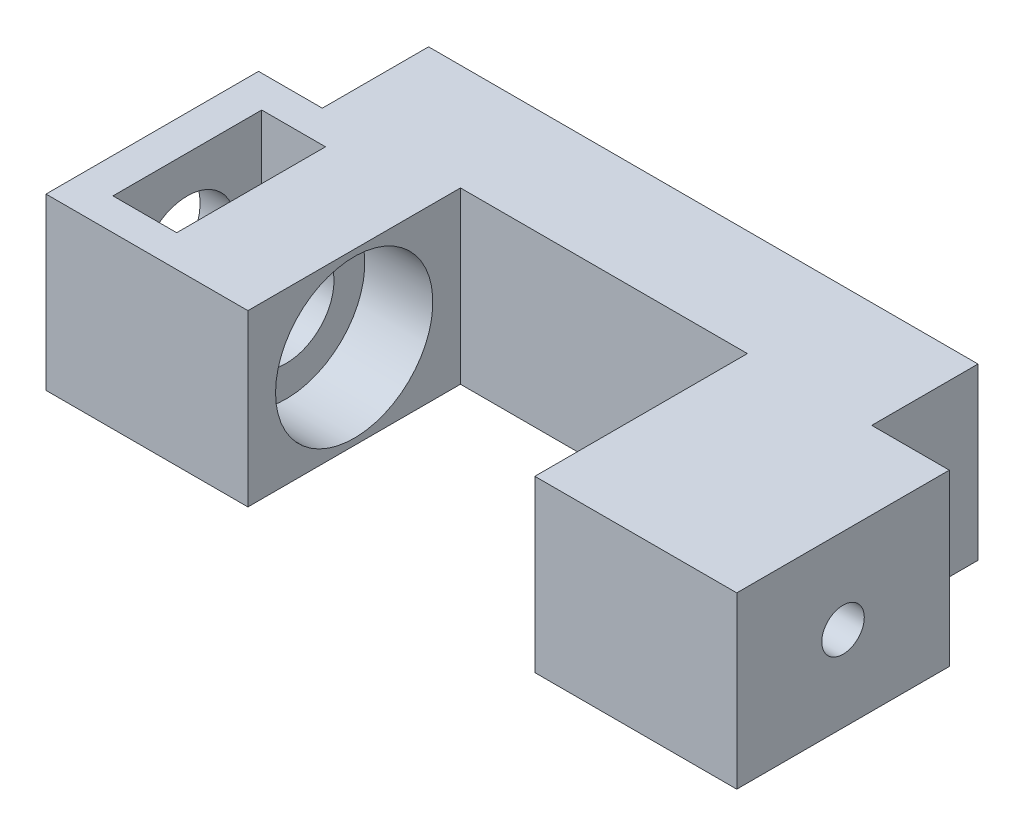
ISO-10303-21;
HEADER;
FILE_DESCRIPTION(('STEP AP214'),'2;1');
FILE_NAME('part.step','',(''),(''),'','','');
FILE_SCHEMA(('AUTOMOTIVE_DESIGN { 1 0 10303 214 1 1 1 1 }'));
ENDSEC;
DATA;
#1=APPLICATION_CONTEXT('core data for automotive mechanical design processes');
#2=APPLICATION_PROTOCOL_DEFINITION('international standard','automotive_design',2000,#1);
#3=PRODUCT_CONTEXT('',#1,'mechanical');
#4=PRODUCT('Part','Part','',(#3));
#5=PRODUCT_RELATED_PRODUCT_CATEGORY('part','',(#4));
#6=PRODUCT_DEFINITION_FORMATION('','',#4);
#7=PRODUCT_DEFINITION_CONTEXT('part definition',#1,'design');
#8=PRODUCT_DEFINITION('design','',#6,#7);
#9=PRODUCT_DEFINITION_SHAPE('','',#8);
#10=(LENGTH_UNIT() NAMED_UNIT(*) SI_UNIT(.MILLI.,.METRE.));
#11=(NAMED_UNIT(*) PLANE_ANGLE_UNIT() SI_UNIT($,.RADIAN.));
#12=(NAMED_UNIT(*) SI_UNIT($,.STERADIAN.) SOLID_ANGLE_UNIT());
#13=UNCERTAINTY_MEASURE_WITH_UNIT(LENGTH_MEASURE(1.E-05),#10,'distance_accuracy_value','');
#14=(GEOMETRIC_REPRESENTATION_CONTEXT(3) GLOBAL_UNCERTAINTY_ASSIGNED_CONTEXT((#13)) GLOBAL_UNIT_ASSIGNED_CONTEXT((#10,
#11,#12)) REPRESENTATION_CONTEXT('',''));
#15=CARTESIAN_POINT('',(0.,0.,0.));
#16=DIRECTION('',(0.,0.,1.));
#17=DIRECTION('',(1.,0.,0.));
#18=AXIS2_PLACEMENT_3D('',#15,#16,#17);
#19=CARTESIAN_POINT('',(-0.249999999999827,40.,-100.));
#20=DIRECTION('',(-1.,0.,0.));
#21=DIRECTION('',(0.,0.,1.));
#22=AXIS2_PLACEMENT_3D('',#19,#20,#21);
#23=CYLINDRICAL_SURFACE('',#22,2.25);
#24=CARTESIAN_POINT('',(-11.6,40.,-100.));
#25=DIRECTION('',(1.,0.,0.));
#26=DIRECTION('',(0.,0.,-1.));
#27=AXIS2_PLACEMENT_3D('',#24,#25,#26);
#28=CIRCLE('',#27,2.25);
#29=CARTESIAN_POINT('',(-11.6,40.,-102.25));
#30=VERTEX_POINT('',#29);
#31=EDGE_CURVE('E207',#30,#30,#28,.F.);
#32=ORIENTED_EDGE('',*,*,#31,.T.);
#33=EDGE_LOOP('',(#32));
#34=FACE_BOUND('',#33,.T.);
#35=CARTESIAN_POINT('',(-9.95000000000021,40.,-100.));
#36=DIRECTION('',(1.,0.,0.));
#37=DIRECTION('',(0.,0.,-1.));
#38=AXIS2_PLACEMENT_3D('',#35,#36,#37);
#39=CIRCLE('',#38,2.25);
#40=CARTESIAN_POINT('',(-9.95000000000021,40.,-102.25));
#41=VERTEX_POINT('',#40);
#42=EDGE_CURVE('E242',#41,#41,#39,.F.);
#43=ORIENTED_EDGE('',*,*,#42,.F.);
#44=EDGE_LOOP('',(#43));
#45=FACE_BOUND('',#44,.T.);
#46=ADVANCED_FACE('F33',(#34,#45),#23,.F.);
#47=CARTESIAN_POINT('',(-14.6,40.,-100.));
#48=DIRECTION('',(-1.,0.,0.));
#49=DIRECTION('',(0.,0.,1.));
#50=AXIS2_PLACEMENT_3D('',#47,#48,#49);
#51=CIRCLE('',#50,2.25);
#52=CARTESIAN_POINT('',(-14.6,40.,-97.75));
#53=VERTEX_POINT('',#52);
#54=EDGE_CURVE('E200',#53,#53,#51,.F.);
#55=ORIENTED_EDGE('',*,*,#54,.T.);
#56=EDGE_LOOP('',(#55));
#57=FACE_BOUND('',#56,.T.);
#58=CARTESIAN_POINT('',(-16.2499999999998,40.,-100.));
#59=DIRECTION('',(-1.,0.,0.));
#60=DIRECTION('',(0.,0.,1.));
#61=AXIS2_PLACEMENT_3D('',#58,#59,#60);
#62=CIRCLE('',#61,2.25);
#63=CARTESIAN_POINT('',(-16.2499999999998,40.,-97.75));
#64=VERTEX_POINT('',#63);
#65=EDGE_CURVE('E210',#64,#64,#62,.T.);
#66=ORIENTED_EDGE('',*,*,#65,.T.);
#67=EDGE_LOOP('',(#66));
#68=FACE_BOUND('',#67,.T.);
#69=ADVANCED_FACE('F330',(#57,#68),#23,.F.);
#70=CARTESIAN_POINT('',(-13.25,44.,-105.));
#71=DIRECTION('',(-1.,0.,0.));
#72=DIRECTION('',(0.,0.,1.));
#73=AXIS2_PLACEMENT_3D('',#70,#71,#72);
#74=PLANE('',#73);
#75=DIRECTION('',(0.,-1.,0.));
#76=VECTOR('',#75,1.);
#77=CARTESIAN_POINT('',(-13.2499999999998,44.,-105.));
#78=LINE('',#77,#76);
#79=CARTESIAN_POINT('',(-13.25,44.,-105.));
#80=VERTEX_POINT('',#79);
#81=CARTESIAN_POINT('',(-13.2499999999998,36.,-105.));
#82=VERTEX_POINT('',#81);
#83=EDGE_CURVE('E213',#80,#82,#78,.T.);
#84=ORIENTED_EDGE('',*,*,#83,.F.);
#85=DIRECTION('',(0.,0.,-1.));
#86=VECTOR('',#85,1.);
#87=CARTESIAN_POINT('',(-13.25,44.,-110.));
#88=LINE('',#87,#86);
#89=CARTESIAN_POINT('',(-13.25,44.,-110.));
#90=VERTEX_POINT('',#89);
#91=EDGE_CURVE('E268',#80,#90,#88,.T.);
#92=ORIENTED_EDGE('',*,*,#91,.T.);
#93=DIRECTION('',(0.,-1.,0.));
#94=VECTOR('',#93,1.);
#95=CARTESIAN_POINT('',(-13.25,44.,-110.));
#96=LINE('',#95,#94);
#97=CARTESIAN_POINT('',(-13.25,36.,-110.));
#98=VERTEX_POINT('',#97);
#99=EDGE_CURVE('E287',#90,#98,#96,.T.);
#100=ORIENTED_EDGE('',*,*,#99,.T.);
#101=DIRECTION('',(0.,0.,-1.));
#102=VECTOR('',#101,1.);
#103=CARTESIAN_POINT('',(-13.25,36.,-110.));
#104=LINE('',#103,#102);
#105=EDGE_CURVE('E248',#82,#98,#104,.T.);
#106=ORIENTED_EDGE('',*,*,#105,.F.);
#107=EDGE_LOOP('',(#84,#92,#100,#106));
#108=FACE_BOUND('',#107,.T.);
#109=ADVANCED_FACE('F358',(#108),#74,.T.);
#110=CARTESIAN_POINT('',(-13.25,44.,-95.));
#111=DIRECTION('',(0.,0.,1.));
#112=DIRECTION('',(1.,0.,0.));
#113=AXIS2_PLACEMENT_3D('',#110,#111,#112);
#114=PLANE('',#113);
#115=DIRECTION('',(-1.,0.,0.));
#116=VECTOR('',#115,1.);
#117=CARTESIAN_POINT('',(-13.25,44.,-95.));
#118=LINE('',#117,#116);
#119=CARTESIAN_POINT('',(-6.75,44.,-95.));
#120=VERTEX_POINT('',#119);
#121=CARTESIAN_POINT('',(-16.2499999999998,44.,-95.));
#122=VERTEX_POINT('',#121);
#123=EDGE_CURVE('E285',#120,#122,#118,.T.);
#124=ORIENTED_EDGE('',*,*,#123,.T.);
#125=DIRECTION('',(0.,1.,0.));
#126=VECTOR('',#125,1.);
#127=CARTESIAN_POINT('',(-16.2499999999998,44.,-95.));
#128=LINE('',#127,#126);
#129=CARTESIAN_POINT('',(-16.2499999999998,36.,-95.));
#130=VERTEX_POINT('',#129);
#131=EDGE_CURVE('E214',#130,#122,#128,.T.);
#132=ORIENTED_EDGE('',*,*,#131,.F.);
#133=DIRECTION('',(-1.,0.,0.));
#134=VECTOR('',#133,1.);
#135=CARTESIAN_POINT('',(-13.25,36.,-95.));
#136=LINE('',#135,#134);
#137=CARTESIAN_POINT('',(-6.75,36.,-95.));
#138=VERTEX_POINT('',#137);
#139=EDGE_CURVE('E266',#138,#130,#136,.T.);
#140=ORIENTED_EDGE('',*,*,#139,.F.);
#141=DIRECTION('',(0.,-1.,0.));
#142=VECTOR('',#141,1.);
#143=CARTESIAN_POINT('',(-6.75,44.,-95.));
#144=LINE('',#143,#142);
#145=EDGE_CURVE('E288',#120,#138,#144,.T.);
#146=ORIENTED_EDGE('',*,*,#145,.F.);
#147=EDGE_LOOP('',(#124,#132,#140,#146));
#148=FACE_BOUND('',#147,.T.);
#149=ADVANCED_FACE('F367',(#148),#114,.T.);
#150=CARTESIAN_POINT('',(-6.75,44.,-95.));
#151=DIRECTION('',(1.,0.,0.));
#152=DIRECTION('',(0.,0.,-1.));
#153=AXIS2_PLACEMENT_3D('',#150,#151,#152);
#154=PLANE('',#153);
#155=CARTESIAN_POINT('',(-6.75000000000021,40.,-100.));
#156=DIRECTION('',(-1.,0.,0.));
#157=DIRECTION('',(0.,0.,1.));
#158=AXIS2_PLACEMENT_3D('',#155,#156,#157);
#159=CIRCLE('',#158,3.7);
#160=CARTESIAN_POINT('',(-6.7500000000002,40.,-96.3));
#161=VERTEX_POINT('',#160);
#162=EDGE_CURVE('E236',#161,#161,#159,.T.);
#163=ORIENTED_EDGE('',*,*,#162,.T.);
#164=EDGE_LOOP('',(#163));
#165=FACE_BOUND('',#164,.T.);
#166=ORIENTED_EDGE('',*,*,#145,.T.);
#167=DIRECTION('',(0.,0.,1.));
#168=VECTOR('',#167,1.);
#169=CARTESIAN_POINT('',(-6.75,36.,-95.));
#170=LINE('',#169,#168);
#171=CARTESIAN_POINT('',(-6.75,36.,-105.));
#172=VERTEX_POINT('',#171);
#173=EDGE_CURVE('E263',#172,#138,#170,.T.);
#174=ORIENTED_EDGE('',*,*,#173,.F.);
#175=DIRECTION('',(0.,-1.,0.));
#176=VECTOR('',#175,1.);
#177=CARTESIAN_POINT('',(-6.75,44.,-105.));
#178=LINE('',#177,#176);
#179=CARTESIAN_POINT('',(-6.75,44.,-105.));
#180=VERTEX_POINT('',#179);
#181=EDGE_CURVE('E291',#180,#172,#178,.T.);
#182=ORIENTED_EDGE('',*,*,#181,.F.);
#183=DIRECTION('',(0.,0.,1.));
#184=VECTOR('',#183,1.);
#185=CARTESIAN_POINT('',(-6.75,44.,-95.));
#186=LINE('',#185,#184);
#187=EDGE_CURVE('E282',#180,#120,#186,.T.);
#188=ORIENTED_EDGE('',*,*,#187,.T.);
#189=EDGE_LOOP('',(#166,#174,#182,#188));
#190=FACE_BOUND('',#189,.T.);
#191=ADVANCED_FACE('F371',(#165,#190),#154,.T.);
#192=CARTESIAN_POINT('',(-6.75,44.,-105.));
#193=DIRECTION('',(0.,0.,1.));
#194=DIRECTION('',(1.,0.,0.));
#195=AXIS2_PLACEMENT_3D('',#192,#193,#194);
#196=PLANE('',#195);
#197=ORIENTED_EDGE('',*,*,#181,.T.);
#198=DIRECTION('',(-1.,0.,0.));
#199=VECTOR('',#198,1.);
#200=CARTESIAN_POINT('',(-6.75,36.,-105.));
#201=LINE('',#200,#199);
#202=CARTESIAN_POINT('',(6.75,36.,-105.));
#203=VERTEX_POINT('',#202);
#204=EDGE_CURVE('E260',#203,#172,#201,.T.);
#205=ORIENTED_EDGE('',*,*,#204,.F.);
#206=DIRECTION('',(0.,-1.,0.));
#207=VECTOR('',#206,1.);
#208=CARTESIAN_POINT('',(6.75,44.,-105.));
#209=LINE('',#208,#207);
#210=CARTESIAN_POINT('',(6.75,44.,-105.));
#211=VERTEX_POINT('',#210);
#212=EDGE_CURVE('E293',#211,#203,#209,.T.);
#213=ORIENTED_EDGE('',*,*,#212,.F.);
#214=DIRECTION('',(-1.,0.,0.));
#215=VECTOR('',#214,1.);
#216=CARTESIAN_POINT('',(-6.75,44.,-105.));
#217=LINE('',#216,#215);
#218=EDGE_CURVE('E279',#211,#180,#217,.T.);
#219=ORIENTED_EDGE('',*,*,#218,.T.);
#220=EDGE_LOOP('',(#197,#205,#213,#219));
#221=FACE_BOUND('',#220,.T.);
#222=ADVANCED_FACE('F375',(#221),#196,.T.);
#223=CARTESIAN_POINT('',(6.75,44.,-105.));
#224=DIRECTION('',(-1.,0.,0.));
#225=DIRECTION('',(0.,0.,1.));
#226=AXIS2_PLACEMENT_3D('',#223,#224,#225);
#227=PLANE('',#226);
#228=CARTESIAN_POINT('',(6.75000000000021,40.,-100.));
#229=DIRECTION('',(-1.,0.,0.));
#230=DIRECTION('',(0.,0.,1.));
#231=AXIS2_PLACEMENT_3D('',#228,#229,#230);
#232=CIRCLE('',#231,3.7);
#233=CARTESIAN_POINT('',(6.7500000000002,40.,-96.3));
#234=VERTEX_POINT('',#233);
#235=EDGE_CURVE('E249',#234,#234,#232,.T.);
#236=ORIENTED_EDGE('',*,*,#235,.F.);
#237=EDGE_LOOP('',(#236));
#238=FACE_BOUND('',#237,.T.);
#239=ORIENTED_EDGE('',*,*,#212,.T.);
#240=DIRECTION('',(0.,0.,-1.));
#241=VECTOR('',#240,1.);
#242=CARTESIAN_POINT('',(6.75,36.,-105.));
#243=LINE('',#242,#241);
#244=CARTESIAN_POINT('',(6.75,36.,-95.));
#245=VERTEX_POINT('',#244);
#246=EDGE_CURVE('E257',#245,#203,#243,.T.);
#247=ORIENTED_EDGE('',*,*,#246,.F.);
#248=DIRECTION('',(0.,-1.,0.));
#249=VECTOR('',#248,1.);
#250=CARTESIAN_POINT('',(6.75,44.,-95.));
#251=LINE('',#250,#249);
#252=CARTESIAN_POINT('',(6.75,44.,-95.));
#253=VERTEX_POINT('',#252);
#254=EDGE_CURVE('E295',#253,#245,#251,.T.);
#255=ORIENTED_EDGE('',*,*,#254,.F.);
#256=DIRECTION('',(0.,0.,-1.));
#257=VECTOR('',#256,1.);
#258=CARTESIAN_POINT('',(6.75,44.,-105.));
#259=LINE('',#258,#257);
#260=EDGE_CURVE('E276',#253,#211,#259,.T.);
#261=ORIENTED_EDGE('',*,*,#260,.T.);
#262=EDGE_LOOP('',(#239,#247,#255,#261));
#263=FACE_BOUND('',#262,.T.);
#264=ADVANCED_FACE('F379',(#238,#263),#227,.T.);
#265=CARTESIAN_POINT('',(6.75,44.,-95.));
#266=DIRECTION('',(0.,0.,1.));
#267=DIRECTION('',(1.,0.,0.));
#268=AXIS2_PLACEMENT_3D('',#265,#266,#267);
#269=PLANE('',#268);
#270=ORIENTED_EDGE('',*,*,#254,.T.);
#271=DIRECTION('',(-1.,0.,0.));
#272=VECTOR('',#271,1.);
#273=CARTESIAN_POINT('',(6.75,36.,-95.));
#274=LINE('',#273,#272);
#275=CARTESIAN_POINT('',(16.25,36.,-95.));
#276=VERTEX_POINT('',#275);
#277=EDGE_CURVE('E254',#276,#245,#274,.T.);
#278=ORIENTED_EDGE('',*,*,#277,.F.);
#279=DIRECTION('',(0.,-1.,0.));
#280=VECTOR('',#279,1.);
#281=CARTESIAN_POINT('',(16.25,36.,-95.));
#282=LINE('',#281,#280);
#283=CARTESIAN_POINT('',(16.25,44.,-95.));
#284=VERTEX_POINT('',#283);
#285=EDGE_CURVE('E178',#284,#276,#282,.T.);
#286=ORIENTED_EDGE('',*,*,#285,.F.);
#287=DIRECTION('',(-1.,0.,0.));
#288=VECTOR('',#287,1.);
#289=CARTESIAN_POINT('',(6.75,44.,-95.));
#290=LINE('',#289,#288);
#291=EDGE_CURVE('E273',#284,#253,#290,.T.);
#292=ORIENTED_EDGE('',*,*,#291,.T.);
#293=EDGE_LOOP('',(#270,#278,#286,#292));
#294=FACE_BOUND('',#293,.T.);
#295=ADVANCED_FACE('F382',(#294),#269,.T.);
#296=CARTESIAN_POINT('',(13.25,44.,-110.));
#297=DIRECTION('',(0.,0.,-1.));
#298=DIRECTION('',(-1.,0.,0.));
#299=AXIS2_PLACEMENT_3D('',#296,#297,#298);
#300=PLANE('',#299);
#301=DIRECTION('',(0.,1.,0.));
#302=VECTOR('',#301,1.);
#303=CARTESIAN_POINT('',(12.6,36.,-110.));
#304=LINE('',#303,#302);
#305=CARTESIAN_POINT('',(12.6,36.,-110.));
#306=VERTEX_POINT('',#305);
#307=CARTESIAN_POINT('',(12.6,44.,-110.));
#308=VERTEX_POINT('',#307);
#309=EDGE_CURVE('E172',#306,#308,#304,.T.);
#310=ORIENTED_EDGE('',*,*,#309,.F.);
#311=DIRECTION('',(1.,0.,0.));
#312=VECTOR('',#311,1.);
#313=CARTESIAN_POINT('',(13.25,36.,-110.));
#314=LINE('',#313,#312);
#315=EDGE_CURVE('E171',#98,#306,#314,.T.);
#316=ORIENTED_EDGE('',*,*,#315,.F.);
#317=ORIENTED_EDGE('',*,*,#99,.F.);
#318=DIRECTION('',(1.,0.,0.));
#319=VECTOR('',#318,1.);
#320=CARTESIAN_POINT('',(13.25,44.,-110.));
#321=LINE('',#320,#319);
#322=EDGE_CURVE('E270',#90,#308,#321,.T.);
#323=ORIENTED_EDGE('',*,*,#322,.T.);
#324=EDGE_LOOP('',(#310,#316,#317,#323));
#325=FACE_BOUND('',#324,.T.);
#326=ADVANCED_FACE('F35',(#325),#300,.T.);
#327=CARTESIAN_POINT('',(0.,44.,0.));
#328=DIRECTION('',(0.,1.,0.));
#329=DIRECTION('',(0.,0.,1.));
#330=AXIS2_PLACEMENT_3D('',#327,#328,#329);
#331=PLANE('',#330);
#332=DIRECTION('',(-1.,0.,0.));
#333=VECTOR('',#332,1.);
#334=CARTESIAN_POINT('',(16.25,44.,-105.));
#335=LINE('',#334,#333);
#336=CARTESIAN_POINT('',(16.25,44.,-105.));
#337=VERTEX_POINT('',#336);
#338=CARTESIAN_POINT('',(12.6,44.,-105.));
#339=VERTEX_POINT('',#338);
#340=EDGE_CURVE('E159',#337,#339,#335,.T.);
#341=ORIENTED_EDGE('',*,*,#340,.T.);
#342=DIRECTION('',(0.,0.,1.));
#343=VECTOR('',#342,1.);
#344=CARTESIAN_POINT('',(12.6,44.,-105.));
#345=LINE('',#344,#343);
#346=EDGE_CURVE('E166',#308,#339,#345,.T.);
#347=ORIENTED_EDGE('',*,*,#346,.F.);
#348=ORIENTED_EDGE('',*,*,#322,.F.);
#349=ORIENTED_EDGE('',*,*,#91,.F.);
#350=DIRECTION('',(1.,0.,0.));
#351=VECTOR('',#350,1.);
#352=CARTESIAN_POINT('',(-16.2499999999998,44.,-105.));
#353=LINE('',#352,#351);
#354=CARTESIAN_POINT('',(-16.2499999999998,44.,-105.));
#355=VERTEX_POINT('',#354);
#356=EDGE_CURVE('E229',#355,#80,#353,.T.);
#357=ORIENTED_EDGE('',*,*,#356,.F.);
#358=DIRECTION('',(0.,0.,-1.));
#359=VECTOR('',#358,1.);
#360=CARTESIAN_POINT('',(-16.2499999999998,44.,-95.));
#361=LINE('',#360,#359);
#362=EDGE_CURVE('E217',#122,#355,#361,.T.);
#363=ORIENTED_EDGE('',*,*,#362,.F.);
#364=ORIENTED_EDGE('',*,*,#123,.F.);
#365=ORIENTED_EDGE('',*,*,#187,.F.);
#366=ORIENTED_EDGE('',*,*,#218,.F.);
#367=ORIENTED_EDGE('',*,*,#260,.F.);
#368=ORIENTED_EDGE('',*,*,#291,.F.);
#369=DIRECTION('',(0.,0.,1.));
#370=VECTOR('',#369,1.);
#371=CARTESIAN_POINT('',(16.25,44.,-105.));
#372=LINE('',#371,#370);
#373=EDGE_CURVE('E184',#337,#284,#372,.T.);
#374=ORIENTED_EDGE('',*,*,#373,.F.);
#375=EDGE_LOOP('',(#341,#347,#348,#349,#357,#363,#364,#365,#366,#367,#368,#374));
#376=FACE_BOUND('',#375,.T.);
#377=DIRECTION('',(0.,0.,-1.));
#378=VECTOR('',#377,1.);
#379=CARTESIAN_POINT('',(-11.6,44.,-96.5));
#380=LINE('',#379,#378);
#381=CARTESIAN_POINT('',(-11.6,44.,-96.5));
#382=VERTEX_POINT('',#381);
#383=CARTESIAN_POINT('',(-11.6,44.,-103.5));
#384=VERTEX_POINT('',#383);
#385=EDGE_CURVE('E49',#382,#384,#380,.T.);
#386=ORIENTED_EDGE('',*,*,#385,.F.);
#387=DIRECTION('',(1.,0.,0.));
#388=VECTOR('',#387,1.);
#389=CARTESIAN_POINT('',(-14.6,44.,-96.5));
#390=LINE('',#389,#388);
#391=CARTESIAN_POINT('',(-14.6,44.,-96.5));
#392=VERTEX_POINT('',#391);
#393=EDGE_CURVE('E194',#392,#382,#390,.T.);
#394=ORIENTED_EDGE('',*,*,#393,.F.);
#395=DIRECTION('',(0.,0.,1.));
#396=VECTOR('',#395,1.);
#397=CARTESIAN_POINT('',(-14.6,44.,-96.5));
#398=LINE('',#397,#396);
#399=CARTESIAN_POINT('',(-14.6,44.,-103.5));
#400=VERTEX_POINT('',#399);
#401=EDGE_CURVE('E191',#400,#392,#398,.T.);
#402=ORIENTED_EDGE('',*,*,#401,.F.);
#403=DIRECTION('',(-1.,0.,0.));
#404=VECTOR('',#403,1.);
#405=CARTESIAN_POINT('',(-14.6,44.,-103.5));
#406=LINE('',#405,#404);
#407=EDGE_CURVE('E189',#384,#400,#406,.T.);
#408=ORIENTED_EDGE('',*,*,#407,.F.);
#409=EDGE_LOOP('',(#386,#394,#402,#408));
#410=FACE_BOUND('',#409,.T.);
#411=ADVANCED_FACE('F319',(#376,#410),#331,.T.);
#412=CARTESIAN_POINT('',(0.,36.,0.));
#413=DIRECTION('',(0.,1.,0.));
#414=DIRECTION('',(0.,0.,1.));
#415=AXIS2_PLACEMENT_3D('',#412,#413,#414);
#416=PLANE('',#415);
#417=DIRECTION('',(1.,0.,0.));
#418=VECTOR('',#417,1.);
#419=CARTESIAN_POINT('',(0.,36.,-96.5));
#420=LINE('',#419,#418);
#421=CARTESIAN_POINT('',(-14.6,36.,-96.5));
#422=VERTEX_POINT('',#421);
#423=CARTESIAN_POINT('',(-11.6,36.,-96.5));
#424=VERTEX_POINT('',#423);
#425=EDGE_CURVE('E42',#422,#424,#420,.T.);
#426=ORIENTED_EDGE('',*,*,#425,.T.);
#427=DIRECTION('',(0.,0.,-1.));
#428=VECTOR('',#427,1.);
#429=CARTESIAN_POINT('',(-11.6,36.,0.));
#430=LINE('',#429,#428);
#431=CARTESIAN_POINT('',(-11.6,36.,-103.5));
#432=VERTEX_POINT('',#431);
#433=EDGE_CURVE('E11',#424,#432,#430,.T.);
#434=ORIENTED_EDGE('',*,*,#433,.T.);
#435=DIRECTION('',(-1.,0.,0.));
#436=VECTOR('',#435,1.);
#437=CARTESIAN_POINT('',(0.,36.,-103.5));
#438=LINE('',#437,#436);
#439=CARTESIAN_POINT('',(-14.6,36.,-103.5));
#440=VERTEX_POINT('',#439);
#441=EDGE_CURVE('E290',#432,#440,#438,.T.);
#442=ORIENTED_EDGE('',*,*,#441,.T.);
#443=DIRECTION('',(0.,0.,1.));
#444=VECTOR('',#443,1.);
#445=CARTESIAN_POINT('',(-14.6,36.,0.));
#446=LINE('',#445,#444);
#447=EDGE_CURVE('E303',#440,#422,#446,.T.);
#448=ORIENTED_EDGE('',*,*,#447,.T.);
#449=EDGE_LOOP('',(#426,#434,#442,#448));
#450=FACE_BOUND('',#449,.T.);
#451=DIRECTION('',(0.,0.,-1.));
#452=VECTOR('',#451,1.);
#453=CARTESIAN_POINT('',(12.6,36.,-105.));
#454=LINE('',#453,#452);
#455=CARTESIAN_POINT('',(12.6,36.,-105.));
#456=VERTEX_POINT('',#455);
#457=EDGE_CURVE('E163',#456,#306,#454,.T.);
#458=ORIENTED_EDGE('',*,*,#457,.F.);
#459=DIRECTION('',(-1.,0.,0.));
#460=VECTOR('',#459,1.);
#461=CARTESIAN_POINT('',(16.25,36.,-105.));
#462=LINE('',#461,#460);
#463=CARTESIAN_POINT('',(16.25,36.,-105.));
#464=VERTEX_POINT('',#463);
#465=EDGE_CURVE('E149',#464,#456,#462,.T.);
#466=ORIENTED_EDGE('',*,*,#465,.F.);
#467=DIRECTION('',(0.,0.,-1.));
#468=VECTOR('',#467,1.);
#469=CARTESIAN_POINT('',(16.25,36.,-105.));
#470=LINE('',#469,#468);
#471=EDGE_CURVE('E181',#276,#464,#470,.T.);
#472=ORIENTED_EDGE('',*,*,#471,.F.);
#473=ORIENTED_EDGE('',*,*,#277,.T.);
#474=ORIENTED_EDGE('',*,*,#246,.T.);
#475=ORIENTED_EDGE('',*,*,#204,.T.);
#476=ORIENTED_EDGE('',*,*,#173,.T.);
#477=ORIENTED_EDGE('',*,*,#139,.T.);
#478=DIRECTION('',(0.,0.,1.));
#479=VECTOR('',#478,1.);
#480=CARTESIAN_POINT('',(-16.2499999999998,36.,-95.));
#481=LINE('',#480,#479);
#482=CARTESIAN_POINT('',(-16.2499999999998,36.,-105.));
#483=VERTEX_POINT('',#482);
#484=EDGE_CURVE('E221',#483,#130,#481,.T.);
#485=ORIENTED_EDGE('',*,*,#484,.F.);
#486=DIRECTION('',(1.,0.,0.));
#487=VECTOR('',#486,1.);
#488=CARTESIAN_POINT('',(-16.2499999999998,36.,-105.));
#489=LINE('',#488,#487);
#490=EDGE_CURVE('E224',#483,#82,#489,.T.);
#491=ORIENTED_EDGE('',*,*,#490,.T.);
#492=ORIENTED_EDGE('',*,*,#105,.T.);
#493=ORIENTED_EDGE('',*,*,#315,.T.);
#494=EDGE_LOOP('',(#458,#466,#472,#473,#474,#475,#476,#477,#485,#491,#492,#493));
#495=FACE_BOUND('',#494,.T.);
#496=ADVANCED_FACE('F169',(#450,#495),#416,.F.);
#497=CARTESIAN_POINT('',(9.95000000000021,40.,-100.));
#498=DIRECTION('',(-1.,0.,0.));
#499=DIRECTION('',(0.,0.,1.));
#500=AXIS2_PLACEMENT_3D('',#497,#498,#499);
#501=CYLINDRICAL_SURFACE('',#500,3.7);
#502=CARTESIAN_POINT('',(9.95000000000021,40.,-100.));
#503=DIRECTION('',(-1.,0.,0.));
#504=DIRECTION('',(0.,0.,1.));
#505=AXIS2_PLACEMENT_3D('',#502,#503,#504);
#506=CIRCLE('',#505,3.7);
#507=CARTESIAN_POINT('',(9.9500000000002,40.,-96.3));
#508=VERTEX_POINT('',#507);
#509=EDGE_CURVE('E245',#508,#508,#506,.T.);
#510=ORIENTED_EDGE('',*,*,#509,.F.);
#511=EDGE_LOOP('',(#510));
#512=FACE_BOUND('',#511,.T.);
#513=ORIENTED_EDGE('',*,*,#235,.T.);
#514=EDGE_LOOP('',(#513));
#515=FACE_BOUND('',#514,.T.);
#516=ADVANCED_FACE('F347',(#512,#515),#501,.F.);
#517=CARTESIAN_POINT('',(9.95000000000021,40.,-100.));
#518=DIRECTION('',(-1.,0.,0.));
#519=DIRECTION('',(0.,0.,1.));
#520=AXIS2_PLACEMENT_3D('',#517,#518,#519);
#521=PLANE('',#520);
#522=CARTESIAN_POINT('',(9.95000000000021,40.,-100.));
#523=DIRECTION('',(-1.,0.,0.));
#524=DIRECTION('',(0.,0.,1.));
#525=AXIS2_PLACEMENT_3D('',#522,#523,#524);
#526=CIRCLE('',#525,2.2);
#527=CARTESIAN_POINT('',(9.95000000000021,40.,-97.8));
#528=VERTEX_POINT('',#527);
#529=EDGE_CURVE('E232',#528,#528,#526,.T.);
#530=ORIENTED_EDGE('',*,*,#529,.F.);
#531=EDGE_LOOP('',(#530));
#532=FACE_BOUND('',#531,.T.);
#533=ORIENTED_EDGE('',*,*,#509,.T.);
#534=EDGE_LOOP('',(#533));
#535=FACE_BOUND('',#534,.T.);
#536=ADVANCED_FACE('F337',(#532,#535),#521,.T.);
#537=CARTESIAN_POINT('',(-9.95000000000021,40.,-100.));
#538=DIRECTION('',(1.,0.,0.));
#539=DIRECTION('',(0.,0.,1.));
#540=AXIS2_PLACEMENT_3D('',#537,#538,#539);
#541=PLANE('',#540);
#542=CARTESIAN_POINT('',(-9.95000000000021,40.,-100.));
#543=DIRECTION('',(-1.,0.,0.));
#544=DIRECTION('',(0.,0.,1.));
#545=AXIS2_PLACEMENT_3D('',#542,#543,#544);
#546=CIRCLE('',#545,3.7);
#547=CARTESIAN_POINT('',(-9.9500000000002,40.,-96.3));
#548=VERTEX_POINT('',#547);
#549=EDGE_CURVE('E239',#548,#548,#546,.T.);
#550=ORIENTED_EDGE('',*,*,#549,.F.);
#551=EDGE_LOOP('',(#550));
#552=FACE_BOUND('',#551,.T.);
#553=ORIENTED_EDGE('',*,*,#42,.T.);
#554=EDGE_LOOP('',(#553));
#555=FACE_BOUND('',#554,.T.);
#556=ADVANCED_FACE('F334',(#552,#555),#541,.T.);
#557=CARTESIAN_POINT('',(-9.95000000000021,40.,-100.));
#558=DIRECTION('',(1.,0.,0.));
#559=DIRECTION('',(0.,0.,-1.));
#560=AXIS2_PLACEMENT_3D('',#557,#558,#559);
#561=CYLINDRICAL_SURFACE('',#560,3.7);
#562=ORIENTED_EDGE('',*,*,#549,.T.);
#563=EDGE_LOOP('',(#562));
#564=FACE_BOUND('',#563,.T.);
#565=ORIENTED_EDGE('',*,*,#162,.F.);
#566=EDGE_LOOP('',(#565));
#567=FACE_BOUND('',#566,.T.);
#568=ADVANCED_FACE('F336',(#564,#567),#561,.F.);
#569=CARTESIAN_POINT('',(10.9500000000002,40.,-100.));
#570=DIRECTION('',(-1.,0.,0.));
#571=DIRECTION('',(0.,0.,1.));
#572=AXIS2_PLACEMENT_3D('',#569,#570,#571);
#573=CYLINDRICAL_SURFACE('',#572,2.2);
#574=CARTESIAN_POINT('',(10.9500000000002,40.,-100.));
#575=DIRECTION('',(-1.,0.,0.));
#576=DIRECTION('',(0.,0.,1.));
#577=AXIS2_PLACEMENT_3D('',#574,#575,#576);
#578=CIRCLE('',#577,2.2);
#579=CARTESIAN_POINT('',(10.9500000000002,40.,-97.8));
#580=VERTEX_POINT('',#579);
#581=EDGE_CURVE('E233',#580,#580,#578,.T.);
#582=ORIENTED_EDGE('',*,*,#581,.F.);
#583=EDGE_LOOP('',(#582));
#584=FACE_BOUND('',#583,.T.);
#585=ORIENTED_EDGE('',*,*,#529,.T.);
#586=EDGE_LOOP('',(#585));
#587=FACE_BOUND('',#586,.T.);
#588=ADVANCED_FACE('F344',(#584,#587),#573,.F.);
#589=CARTESIAN_POINT('',(10.9500000000002,40.,-100.));
#590=DIRECTION('',(-1.,0.,0.));
#591=DIRECTION('',(0.,0.,1.));
#592=AXIS2_PLACEMENT_3D('',#589,#590,#591);
#593=PLANE('',#592);
#594=CARTESIAN_POINT('',(10.9500000000002,40.,-100.));
#595=DIRECTION('',(-1.,0.,0.));
#596=DIRECTION('',(0.,0.,1.));
#597=AXIS2_PLACEMENT_3D('',#594,#595,#596);
#598=CIRCLE('',#597,0.999999999999998);
#599=CARTESIAN_POINT('',(10.9500000000002,40.,-99.));
#600=VERTEX_POINT('',#599);
#601=EDGE_CURVE('E449',#600,#600,#598,.T.);
#602=ORIENTED_EDGE('',*,*,#601,.F.);
#603=EDGE_LOOP('',(#602));
#604=FACE_BOUND('',#603,.T.);
#605=ORIENTED_EDGE('',*,*,#581,.T.);
#606=EDGE_LOOP('',(#605));
#607=FACE_BOUND('',#606,.T.);
#608=ADVANCED_FACE('F438',(#604,#607),#593,.T.);
#609=CARTESIAN_POINT('',(-16.25,0.,0.));
#610=DIRECTION('',(1.,0.,0.));
#611=DIRECTION('',(0.,0.,-1.));
#612=AXIS2_PLACEMENT_3D('',#609,#610,#611);
#613=PLANE('',#612);
#614=ORIENTED_EDGE('',*,*,#131,.T.);
#615=ORIENTED_EDGE('',*,*,#362,.T.);
#616=DIRECTION('',(0.,-1.,0.));
#617=VECTOR('',#616,1.);
#618=CARTESIAN_POINT('',(-16.2499999999998,44.,-105.));
#619=LINE('',#618,#617);
#620=EDGE_CURVE('E219',#355,#483,#619,.T.);
#621=ORIENTED_EDGE('',*,*,#620,.T.);
#622=ORIENTED_EDGE('',*,*,#484,.T.);
#623=EDGE_LOOP('',(#614,#615,#621,#622));
#624=FACE_BOUND('',#623,.T.);
#625=ORIENTED_EDGE('',*,*,#65,.F.);
#626=EDGE_LOOP('',(#625));
#627=FACE_BOUND('',#626,.T.);
#628=ADVANCED_FACE('F405',(#624,#627),#613,.F.);
#629=CARTESIAN_POINT('',(-16.2499999999998,44.,-105.));
#630=DIRECTION('',(0.,0.,1.));
#631=DIRECTION('',(1.,0.,0.));
#632=AXIS2_PLACEMENT_3D('',#629,#630,#631);
#633=PLANE('',#632);
#634=ORIENTED_EDGE('',*,*,#83,.T.);
#635=ORIENTED_EDGE('',*,*,#490,.F.);
#636=ORIENTED_EDGE('',*,*,#620,.F.);
#637=ORIENTED_EDGE('',*,*,#356,.T.);
#638=EDGE_LOOP('',(#634,#635,#636,#637));
#639=FACE_BOUND('',#638,.T.);
#640=ADVANCED_FACE('F324',(#639),#633,.F.);
#641=CARTESIAN_POINT('',(-11.6,34.,-96.5));
#642=DIRECTION('',(1.,0.,0.));
#643=DIRECTION('',(0.,0.,-1.));
#644=AXIS2_PLACEMENT_3D('',#641,#642,#643);
#645=PLANE('',#644);
#646=DIRECTION('',(0.,1.,0.));
#647=VECTOR('',#646,1.);
#648=CARTESIAN_POINT('',(-11.6,34.,-96.5));
#649=LINE('',#648,#647);
#650=EDGE_CURVE('E198',#424,#382,#649,.T.);
#651=ORIENTED_EDGE('',*,*,#650,.T.);
#652=ORIENTED_EDGE('',*,*,#385,.T.);
#653=DIRECTION('',(0.,1.,0.));
#654=VECTOR('',#653,1.);
#655=CARTESIAN_POINT('',(-11.6,34.,-103.5));
#656=LINE('',#655,#654);
#657=EDGE_CURVE('E197',#432,#384,#656,.T.);
#658=ORIENTED_EDGE('',*,*,#657,.F.);
#659=ORIENTED_EDGE('',*,*,#433,.F.);
#660=EDGE_LOOP('',(#651,#652,#658,#659));
#661=FACE_BOUND('',#660,.T.);
#662=ORIENTED_EDGE('',*,*,#31,.F.);
#663=EDGE_LOOP('',(#662));
#664=FACE_BOUND('',#663,.T.);
#665=ADVANCED_FACE('F321',(#661,#664),#645,.F.);
#666=CARTESIAN_POINT('',(-14.6,34.,-96.5));
#667=DIRECTION('',(0.,0.,1.));
#668=DIRECTION('',(1.,0.,0.));
#669=AXIS2_PLACEMENT_3D('',#666,#667,#668);
#670=PLANE('',#669);
#671=DIRECTION('',(0.,1.,0.));
#672=VECTOR('',#671,1.);
#673=CARTESIAN_POINT('',(-14.6,34.,-96.5));
#674=LINE('',#673,#672);
#675=EDGE_CURVE('E201',#422,#392,#674,.T.);
#676=ORIENTED_EDGE('',*,*,#675,.T.);
#677=ORIENTED_EDGE('',*,*,#393,.T.);
#678=ORIENTED_EDGE('',*,*,#650,.F.);
#679=ORIENTED_EDGE('',*,*,#425,.F.);
#680=EDGE_LOOP('',(#676,#677,#678,#679));
#681=FACE_BOUND('',#680,.T.);
#682=ADVANCED_FACE('F311',(#681),#670,.F.);
#683=CARTESIAN_POINT('',(-14.6,34.,-96.5));
#684=DIRECTION('',(-1.,0.,0.));
#685=DIRECTION('',(0.,0.,1.));
#686=AXIS2_PLACEMENT_3D('',#683,#684,#685);
#687=PLANE('',#686);
#688=DIRECTION('',(0.,1.,0.));
#689=VECTOR('',#688,1.);
#690=CARTESIAN_POINT('',(-14.6,34.,-103.5));
#691=LINE('',#690,#689);
#692=EDGE_CURVE('E57',#440,#400,#691,.T.);
#693=ORIENTED_EDGE('',*,*,#692,.T.);
#694=ORIENTED_EDGE('',*,*,#401,.T.);
#695=ORIENTED_EDGE('',*,*,#675,.F.);
#696=ORIENTED_EDGE('',*,*,#447,.F.);
#697=EDGE_LOOP('',(#693,#694,#695,#696));
#698=FACE_BOUND('',#697,.T.);
#699=ORIENTED_EDGE('',*,*,#54,.F.);
#700=EDGE_LOOP('',(#699));
#701=FACE_BOUND('',#700,.T.);
#702=ADVANCED_FACE('F313',(#698,#701),#687,.F.);
#703=CARTESIAN_POINT('',(-14.6,34.,-103.5));
#704=DIRECTION('',(0.,0.,-1.));
#705=DIRECTION('',(-1.,0.,0.));
#706=AXIS2_PLACEMENT_3D('',#703,#704,#705);
#707=PLANE('',#706);
#708=ORIENTED_EDGE('',*,*,#657,.T.);
#709=ORIENTED_EDGE('',*,*,#407,.T.);
#710=ORIENTED_EDGE('',*,*,#692,.F.);
#711=ORIENTED_EDGE('',*,*,#441,.F.);
#712=EDGE_LOOP('',(#708,#709,#710,#711));
#713=FACE_BOUND('',#712,.T.);
#714=ADVANCED_FACE('F320',(#713),#707,.F.);
#715=CARTESIAN_POINT('',(16.25,36.,-105.));
#716=DIRECTION('',(0.,0.,1.));
#717=DIRECTION('',(1.,0.,0.));
#718=AXIS2_PLACEMENT_3D('',#715,#716,#717);
#719=PLANE('',#718);
#720=ORIENTED_EDGE('',*,*,#465,.T.);
#721=DIRECTION('',(0.,-1.,0.));
#722=VECTOR('',#721,1.);
#723=CARTESIAN_POINT('',(12.6,36.,-105.));
#724=LINE('',#723,#722);
#725=EDGE_CURVE('E153',#339,#456,#724,.T.);
#726=ORIENTED_EDGE('',*,*,#725,.F.);
#727=ORIENTED_EDGE('',*,*,#340,.F.);
#728=DIRECTION('',(0.,1.,0.));
#729=VECTOR('',#728,1.);
#730=CARTESIAN_POINT('',(16.25,36.,-105.));
#731=LINE('',#730,#729);
#732=EDGE_CURVE('E155',#464,#337,#731,.T.);
#733=ORIENTED_EDGE('',*,*,#732,.F.);
#734=EDGE_LOOP('',(#720,#726,#727,#733));
#735=FACE_BOUND('',#734,.T.);
#736=ADVANCED_FACE('F151',(#735),#719,.F.);
#737=CARTESIAN_POINT('',(16.25,0.,0.));
#738=DIRECTION('',(1.,0.,0.));
#739=DIRECTION('',(0.,0.,-1.));
#740=AXIS2_PLACEMENT_3D('',#737,#738,#739);
#741=PLANE('',#740);
#742=CARTESIAN_POINT('',(16.25,40.,-100.));
#743=DIRECTION('',(1.,0.,0.));
#744=DIRECTION('',(0.,0.,-1.));
#745=AXIS2_PLACEMENT_3D('',#742,#743,#744);
#746=CIRCLE('',#745,0.999999999999998);
#747=CARTESIAN_POINT('',(16.25,40.,-101.));
#748=VERTEX_POINT('',#747);
#749=EDGE_CURVE('E37',#748,#748,#746,.T.);
#750=ORIENTED_EDGE('',*,*,#749,.F.);
#751=EDGE_LOOP('',(#750));
#752=FACE_BOUND('',#751,.T.);
#753=ORIENTED_EDGE('',*,*,#285,.T.);
#754=ORIENTED_EDGE('',*,*,#471,.T.);
#755=ORIENTED_EDGE('',*,*,#732,.T.);
#756=ORIENTED_EDGE('',*,*,#373,.T.);
#757=EDGE_LOOP('',(#753,#754,#755,#756));
#758=FACE_BOUND('',#757,.T.);
#759=ADVANCED_FACE('F416',(#752,#758),#741,.T.);
#760=CARTESIAN_POINT('',(12.6,0.,0.));
#761=DIRECTION('',(-1.,0.,0.));
#762=DIRECTION('',(0.,0.,1.));
#763=AXIS2_PLACEMENT_3D('',#760,#761,#762);
#764=PLANE('',#763);
#765=ORIENTED_EDGE('',*,*,#725,.T.);
#766=ORIENTED_EDGE('',*,*,#457,.T.);
#767=ORIENTED_EDGE('',*,*,#309,.T.);
#768=ORIENTED_EDGE('',*,*,#346,.T.);
#769=EDGE_LOOP('',(#765,#766,#767,#768));
#770=FACE_BOUND('',#769,.T.);
#771=ADVANCED_FACE('F162',(#770),#764,.F.);
#772=CARTESIAN_POINT('',(20.9500000000002,40.,-100.));
#773=DIRECTION('',(-1.,0.,0.));
#774=DIRECTION('',(0.,0.,1.));
#775=AXIS2_PLACEMENT_3D('',#772,#773,#774);
#776=CYLINDRICAL_SURFACE('',#775,0.999999999999998);
#777=ORIENTED_EDGE('',*,*,#749,.T.);
#778=EDGE_LOOP('',(#777));
#779=FACE_BOUND('',#778,.T.);
#780=ORIENTED_EDGE('',*,*,#601,.T.);
#781=EDGE_LOOP('',(#780));
#782=FACE_BOUND('',#781,.T.);
#783=ADVANCED_FACE('F424',(#779,#782),#776,.F.);
#784=CLOSED_SHELL('',(#46,#69,#109,#149,#191,#222,#264,#295,#326,#411,#496,#516,#536,#556,#568,
#588,#608,#628,#640,#665,#682,#702,#714,#736,#759,#771,#783));
#785=MANIFOLD_SOLID_BREP('B2',#784);
#786=ADVANCED_BREP_SHAPE_REPRESENTATION('',(#18,#785),#14);
#787=SHAPE_DEFINITION_REPRESENTATION(#9,#786);
ENDSEC;
END-ISO-10303-21;
